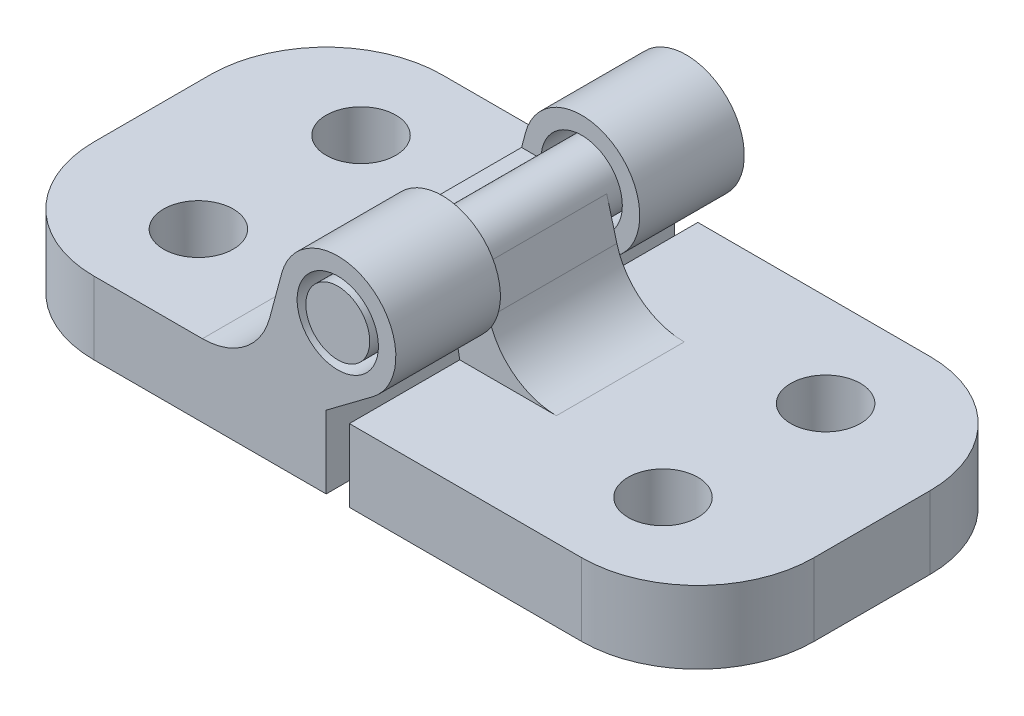
ISO-10303-21;
HEADER;
FILE_DESCRIPTION(('STEP AP214'),'2;1');
FILE_NAME('part.step','',(''),(''),'','','');
FILE_SCHEMA(('AUTOMOTIVE_DESIGN { 1 0 10303 214 1 1 1 1 }'));
ENDSEC;
DATA;
#1=APPLICATION_CONTEXT('core data for automotive mechanical design processes');
#2=APPLICATION_PROTOCOL_DEFINITION('international standard','automotive_design',2000,#1);
#3=PRODUCT_CONTEXT('',#1,'mechanical');
#4=PRODUCT('Part','Part','',(#3));
#5=PRODUCT_RELATED_PRODUCT_CATEGORY('part','',(#4));
#6=PRODUCT_DEFINITION_FORMATION('','',#4);
#7=PRODUCT_DEFINITION_CONTEXT('part definition',#1,'design');
#8=PRODUCT_DEFINITION('design','',#6,#7);
#9=PRODUCT_DEFINITION_SHAPE('','',#8);
#10=(LENGTH_UNIT() NAMED_UNIT(*) SI_UNIT(.MILLI.,.METRE.));
#11=(NAMED_UNIT(*) PLANE_ANGLE_UNIT() SI_UNIT($,.RADIAN.));
#12=(NAMED_UNIT(*) SI_UNIT($,.STERADIAN.) SOLID_ANGLE_UNIT());
#13=UNCERTAINTY_MEASURE_WITH_UNIT(LENGTH_MEASURE(1.E-05),#10,'distance_accuracy_value','');
#14=(GEOMETRIC_REPRESENTATION_CONTEXT(3) GLOBAL_UNCERTAINTY_ASSIGNED_CONTEXT((#13)) GLOBAL_UNIT_ASSIGNED_CONTEXT((#10,
#11,#12)) REPRESENTATION_CONTEXT('',''));
#15=CARTESIAN_POINT('',(0.,0.,0.));
#16=DIRECTION('',(0.,0.,1.));
#17=DIRECTION('',(1.,0.,0.));
#18=AXIS2_PLACEMENT_3D('',#15,#16,#17);
#19=CARTESIAN_POINT('',(15.501,3.375,2.75));
#20=DIRECTION('',(0.,0.,-1.));
#21=DIRECTION('',(-1.,0.,0.));
#22=AXIS2_PLACEMENT_3D('',#19,#20,#21);
#23=PLANE('',#22);
#24=CARTESIAN_POINT('',(0.,6.625,2.75));
#25=DIRECTION('',(0.,0.,-1.));
#26=DIRECTION('',(-1.,0.,0.));
#27=AXIS2_PLACEMENT_3D('',#24,#25,#26);
#28=CIRCLE('',#27,1.375);
#29=CARTESIAN_POINT('',(0.124312268872174,5.25563099939868,2.75));
#30=VERTEX_POINT('',#29);
#31=CARTESIAN_POINT('',(1.32814801114747,6.98087618701597,2.75));
#32=VERTEX_POINT('',#31);
#33=EDGE_CURVE('E208',#30,#32,#28,.F.);
#34=ORIENTED_EDGE('',*,*,#33,.F.);
#35=DIRECTION('',(-0.173648177666927,0.984807753012209,0.));
#36=VECTOR('',#35,1.);
#37=CARTESIAN_POINT('',(0.124312268872174,5.25563099939868,2.75));
#38=LINE('',#37,#36);
#39=CARTESIAN_POINT('',(0.499999999999995,3.125,2.75));
#40=VERTEX_POINT('',#39);
#41=EDGE_CURVE('E147',#40,#30,#38,.T.);
#42=ORIENTED_EDGE('',*,*,#41,.F.);
#43=DIRECTION('',(-1.,0.,0.));
#44=VECTOR('',#43,1.);
#45=CARTESIAN_POINT('',(0.499999999999996,3.125,2.75));
#46=LINE('',#45,#44);
#47=CARTESIAN_POINT('',(4.66330788550968,3.125,2.75));
#48=VERTEX_POINT('',#47);
#49=EDGE_CURVE('E71',#48,#40,#46,.T.);
#50=ORIENTED_EDGE('',*,*,#49,.F.);
#51=CARTESIAN_POINT('',(4.66330788550968,6.125,2.75));
#52=DIRECTION('',(0.,0.,-1.));
#53=DIRECTION('',(-1.,0.,0.));
#54=AXIS2_PLACEMENT_3D('',#51,#52,#53);
#55=CIRCLE('',#54,3.);
#56=CARTESIAN_POINT('',(1.76553040664248,5.34854286469243,2.75));
#57=VERTEX_POINT('',#56);
#58=EDGE_CURVE('E13',#48,#57,#55,.T.);
#59=ORIENTED_EDGE('',*,*,#58,.T.);
#60=DIRECTION('',(0.258819045102525,-0.965925826289067,0.));
#61=VECTOR('',#60,1.);
#62=CARTESIAN_POINT('',(2.36132692157281,3.125,2.75));
#63=LINE('',#62,#61);
#64=EDGE_CURVE('E149',#32,#57,#63,.T.);
#65=ORIENTED_EDGE('',*,*,#64,.F.);
#66=EDGE_LOOP('',(#34,#42,#50,#59,#65));
#67=FACE_BOUND('',#66,.T.);
#68=ADVANCED_FACE('F49',(#67),#23,.F.);
#69=CARTESIAN_POINT('',(0.,3.125,0.));
#70=DIRECTION('',(0.,1.,0.));
#71=DIRECTION('',(0.,0.,1.));
#72=AXIS2_PLACEMENT_3D('',#69,#70,#71);
#73=PLANE('',#72);
#74=CARTESIAN_POINT('',(10.,3.125,3.5));
#75=DIRECTION('',(0.,1.,0.));
#76=DIRECTION('',(0.,0.,1.));
#77=AXIS2_PLACEMENT_3D('',#74,#75,#76);
#78=CIRCLE('',#77,1.5);
#79=CARTESIAN_POINT('',(10.,3.125,5.));
#80=VERTEX_POINT('',#79);
#81=EDGE_CURVE('E304',#80,#80,#78,.T.);
#82=ORIENTED_EDGE('',*,*,#81,.F.);
#83=EDGE_LOOP('',(#82));
#84=FACE_BOUND('',#83,.T.);
#85=CARTESIAN_POINT('',(10.,3.125,-3.5));
#86=DIRECTION('',(0.,1.,0.));
#87=DIRECTION('',(0.,0.,-1.));
#88=AXIS2_PLACEMENT_3D('',#85,#86,#87);
#89=CIRCLE('',#88,1.5);
#90=CARTESIAN_POINT('',(10.,3.125,-5.));
#91=VERTEX_POINT('',#90);
#92=EDGE_CURVE('E317',#91,#91,#89,.T.);
#93=ORIENTED_EDGE('',*,*,#92,.F.);
#94=EDGE_LOOP('',(#93));
#95=FACE_BOUND('',#94,.T.);
#96=DIRECTION('',(-1.,0.,0.));
#97=VECTOR('',#96,1.);
#98=CARTESIAN_POINT('',(0.499999999999996,3.125,-2.75));
#99=LINE('',#98,#97);
#100=CARTESIAN_POINT('',(4.66330788550968,3.125,-2.75));
#101=VERTEX_POINT('',#100);
#102=CARTESIAN_POINT('',(0.499999999999996,3.125,-2.75));
#103=VERTEX_POINT('',#102);
#104=EDGE_CURVE('E64',#101,#103,#99,.T.);
#105=ORIENTED_EDGE('',*,*,#104,.F.);
#106=DIRECTION('',(0.,0.,-1.));
#107=VECTOR('',#106,1.);
#108=CARTESIAN_POINT('',(4.66330788550968,3.125,0.));
#109=LINE('',#108,#107);
#110=EDGE_CURVE('E186',#101,#48,#109,.F.);
#111=ORIENTED_EDGE('',*,*,#110,.T.);
#112=ORIENTED_EDGE('',*,*,#49,.T.);
#113=DIRECTION('',(0.,0.,-1.));
#114=VECTOR('',#113,1.);
#115=CARTESIAN_POINT('',(0.499999999999996,3.125,7.5));
#116=LINE('',#115,#114);
#117=CARTESIAN_POINT('',(0.499999999999996,3.125,7.5));
#118=VERTEX_POINT('',#117);
#119=EDGE_CURVE('E195',#118,#40,#116,.T.);
#120=ORIENTED_EDGE('',*,*,#119,.F.);
#121=DIRECTION('',(-1.,0.,0.));
#122=VECTOR('',#121,1.);
#123=CARTESIAN_POINT('',(15.5,3.125,7.5));
#124=LINE('',#123,#122);
#125=CARTESIAN_POINT('',(10.5,3.125,7.5));
#126=VERTEX_POINT('',#125);
#127=EDGE_CURVE('E219',#126,#118,#124,.T.);
#128=ORIENTED_EDGE('',*,*,#127,.F.);
#129=CARTESIAN_POINT('',(10.5,3.125,2.5));
#130=DIRECTION('',(0.,1.,0.));
#131=DIRECTION('',(0.,0.,1.));
#132=AXIS2_PLACEMENT_3D('',#129,#130,#131);
#133=CIRCLE('',#132,5.);
#134=CARTESIAN_POINT('',(15.5,3.125,2.5));
#135=VERTEX_POINT('',#134);
#136=EDGE_CURVE('E178',#126,#135,#133,.T.);
#137=ORIENTED_EDGE('',*,*,#136,.T.);
#138=DIRECTION('',(0.,0.,-1.));
#139=VECTOR('',#138,1.);
#140=CARTESIAN_POINT('',(15.5,3.125,7.5));
#141=LINE('',#140,#139);
#142=CARTESIAN_POINT('',(15.5,3.125,-2.5));
#143=VERTEX_POINT('',#142);
#144=EDGE_CURVE('E165',#135,#143,#141,.T.);
#145=ORIENTED_EDGE('',*,*,#144,.T.);
#146=CARTESIAN_POINT('',(10.5,3.125,-2.5));
#147=DIRECTION('',(0.,1.,0.));
#148=DIRECTION('',(0.,0.,1.));
#149=AXIS2_PLACEMENT_3D('',#146,#147,#148);
#150=CIRCLE('',#149,5.);
#151=CARTESIAN_POINT('',(10.5,3.125,-7.5));
#152=VERTEX_POINT('',#151);
#153=EDGE_CURVE('E176',#143,#152,#150,.T.);
#154=ORIENTED_EDGE('',*,*,#153,.T.);
#155=DIRECTION('',(-1.,0.,0.));
#156=VECTOR('',#155,1.);
#157=CARTESIAN_POINT('',(15.5,3.125,-7.5));
#158=LINE('',#157,#156);
#159=CARTESIAN_POINT('',(0.499999999999994,3.125,-7.5));
#160=VERTEX_POINT('',#159);
#161=EDGE_CURVE('E204',#152,#160,#158,.T.);
#162=ORIENTED_EDGE('',*,*,#161,.T.);
#163=EDGE_CURVE('E205',#103,#160,#116,.T.);
#164=ORIENTED_EDGE('',*,*,#163,.F.);
#165=EDGE_LOOP('',(#105,#111,#112,#120,#128,#137,#145,#154,#162,#164));
#166=FACE_BOUND('',#165,.T.);
#167=ADVANCED_FACE('F191',(#84,#95,#166),#73,.T.);
#168=CARTESIAN_POINT('',(15.5,3.125,7.5));
#169=DIRECTION('',(-1.,0.,0.));
#170=DIRECTION('',(0.,0.,1.));
#171=AXIS2_PLACEMENT_3D('',#168,#169,#170);
#172=PLANE('',#171);
#173=ORIENTED_EDGE('',*,*,#144,.F.);
#174=DIRECTION('',(0.,-1.,0.));
#175=VECTOR('',#174,1.);
#176=CARTESIAN_POINT('',(15.5,0.,2.5));
#177=LINE('',#176,#175);
#178=CARTESIAN_POINT('',(15.5,0.,2.5));
#179=VERTEX_POINT('',#178);
#180=EDGE_CURVE('E159',#135,#179,#177,.T.);
#181=ORIENTED_EDGE('',*,*,#180,.T.);
#182=DIRECTION('',(0.,0.,-1.));
#183=VECTOR('',#182,1.);
#184=CARTESIAN_POINT('',(15.5,0.,7.5));
#185=LINE('',#184,#183);
#186=CARTESIAN_POINT('',(15.5,0.,-2.5));
#187=VERTEX_POINT('',#186);
#188=EDGE_CURVE('E157',#179,#187,#185,.T.);
#189=ORIENTED_EDGE('',*,*,#188,.T.);
#190=DIRECTION('',(0.,-1.,0.));
#191=VECTOR('',#190,1.);
#192=CARTESIAN_POINT('',(15.5,3.125,-2.5));
#193=LINE('',#192,#191);
#194=EDGE_CURVE('E156',#187,#143,#193,.F.);
#195=ORIENTED_EDGE('',*,*,#194,.T.);
#196=EDGE_LOOP('',(#173,#181,#189,#195));
#197=FACE_BOUND('',#196,.T.);
#198=ADVANCED_FACE('F250',(#197),#172,.F.);
#199=CARTESIAN_POINT('',(15.5,3.125,-7.5));
#200=DIRECTION('',(0.,0.,1.));
#201=DIRECTION('',(1.,0.,0.));
#202=AXIS2_PLACEMENT_3D('',#199,#200,#201);
#203=PLANE('',#202);
#204=ORIENTED_EDGE('',*,*,#161,.F.);
#205=DIRECTION('',(0.,-1.,0.));
#206=VECTOR('',#205,1.);
#207=CARTESIAN_POINT('',(10.5,3.125,-7.5));
#208=LINE('',#207,#206);
#209=CARTESIAN_POINT('',(10.5,0.,-7.5));
#210=VERTEX_POINT('',#209);
#211=EDGE_CURVE('E180',#152,#210,#208,.T.);
#212=ORIENTED_EDGE('',*,*,#211,.T.);
#213=DIRECTION('',(-1.,0.,0.));
#214=VECTOR('',#213,1.);
#215=CARTESIAN_POINT('',(15.5,0.,-7.5));
#216=LINE('',#215,#214);
#217=CARTESIAN_POINT('',(0.499999999999994,0.,-7.5));
#218=VERTEX_POINT('',#217);
#219=EDGE_CURVE('E162',#210,#218,#216,.T.);
#220=ORIENTED_EDGE('',*,*,#219,.T.);
#221=DIRECTION('',(0.,-1.,0.));
#222=VECTOR('',#221,1.);
#223=CARTESIAN_POINT('',(0.499999999999994,3.125,-7.5));
#224=LINE('',#223,#222);
#225=EDGE_CURVE('E209',#160,#218,#224,.T.);
#226=ORIENTED_EDGE('',*,*,#225,.F.);
#227=EDGE_LOOP('',(#204,#212,#220,#226));
#228=FACE_BOUND('',#227,.T.);
#229=ADVANCED_FACE('F239',(#228),#203,.F.);
#230=CARTESIAN_POINT('',(0.499999999999996,3.125,7.5));
#231=DIRECTION('',(-1.,0.,0.));
#232=DIRECTION('',(0.,0.,1.));
#233=AXIS2_PLACEMENT_3D('',#230,#231,#232);
#234=PLANE('',#233);
#235=DIRECTION('',(0.,0.,-1.));
#236=VECTOR('',#235,1.);
#237=CARTESIAN_POINT('',(0.499999999999996,0.,7.5));
#238=LINE('',#237,#236);
#239=CARTESIAN_POINT('',(0.499999999999996,0.,7.5));
#240=VERTEX_POINT('',#239);
#241=EDGE_CURVE('E222',#240,#218,#238,.T.);
#242=ORIENTED_EDGE('',*,*,#241,.F.);
#243=DIRECTION('',(0.,-1.,0.));
#244=VECTOR('',#243,1.);
#245=CARTESIAN_POINT('',(0.499999999999996,3.125,7.5));
#246=LINE('',#245,#244);
#247=EDGE_CURVE('E203',#118,#240,#246,.T.);
#248=ORIENTED_EDGE('',*,*,#247,.F.);
#249=ORIENTED_EDGE('',*,*,#119,.T.);
#250=DIRECTION('',(0.,0.,-1.));
#251=VECTOR('',#250,1.);
#252=CARTESIAN_POINT('',(0.499999999999996,3.125,9.14213023835133));
#253=LINE('',#252,#251);
#254=EDGE_CURVE('E150',#40,#103,#253,.T.);
#255=ORIENTED_EDGE('',*,*,#254,.T.);
#256=ORIENTED_EDGE('',*,*,#163,.T.);
#257=ORIENTED_EDGE('',*,*,#225,.T.);
#258=EDGE_LOOP('',(#242,#248,#249,#255,#256,#257));
#259=FACE_BOUND('',#258,.T.);
#260=ADVANCED_FACE('F200',(#259),#234,.T.);
#261=CARTESIAN_POINT('',(15.5,3.125,7.5));
#262=DIRECTION('',(0.,0.,1.));
#263=DIRECTION('',(1.,0.,0.));
#264=AXIS2_PLACEMENT_3D('',#261,#262,#263);
#265=PLANE('',#264);
#266=DIRECTION('',(-1.,0.,0.));
#267=VECTOR('',#266,1.);
#268=CARTESIAN_POINT('',(15.5,0.,7.5));
#269=LINE('',#268,#267);
#270=CARTESIAN_POINT('',(10.5,0.,7.5));
#271=VERTEX_POINT('',#270);
#272=EDGE_CURVE('E220',#271,#240,#269,.T.);
#273=ORIENTED_EDGE('',*,*,#272,.F.);
#274=DIRECTION('',(0.,-1.,0.));
#275=VECTOR('',#274,1.);
#276=CARTESIAN_POINT('',(10.5,3.125,7.5));
#277=LINE('',#276,#275);
#278=EDGE_CURVE('E174',#271,#126,#277,.F.);
#279=ORIENTED_EDGE('',*,*,#278,.T.);
#280=ORIENTED_EDGE('',*,*,#127,.T.);
#281=ORIENTED_EDGE('',*,*,#247,.T.);
#282=EDGE_LOOP('',(#273,#279,#280,#281));
#283=FACE_BOUND('',#282,.T.);
#284=ADVANCED_FACE('F247',(#283),#265,.T.);
#285=CARTESIAN_POINT('',(0.,0.,0.));
#286=DIRECTION('',(0.,1.,0.));
#287=DIRECTION('',(0.,0.,1.));
#288=AXIS2_PLACEMENT_3D('',#285,#286,#287);
#289=PLANE('',#288);
#290=CARTESIAN_POINT('',(10.,0.,3.5));
#291=DIRECTION('',(0.,1.,0.));
#292=DIRECTION('',(0.,0.,1.));
#293=AXIS2_PLACEMENT_3D('',#290,#291,#292);
#294=CIRCLE('',#293,1.5);
#295=CARTESIAN_POINT('',(10.,0.,5.));
#296=VERTEX_POINT('',#295);
#297=EDGE_CURVE('E307',#296,#296,#294,.F.);
#298=ORIENTED_EDGE('',*,*,#297,.F.);
#299=EDGE_LOOP('',(#298));
#300=FACE_BOUND('',#299,.T.);
#301=CARTESIAN_POINT('',(10.,0.,-3.5));
#302=DIRECTION('',(0.,1.,0.));
#303=DIRECTION('',(0.,0.,1.));
#304=AXIS2_PLACEMENT_3D('',#301,#302,#303);
#305=CIRCLE('',#304,1.5);
#306=CARTESIAN_POINT('',(10.,0.,-2.));
#307=VERTEX_POINT('',#306);
#308=EDGE_CURVE('E314',#307,#307,#305,.F.);
#309=ORIENTED_EDGE('',*,*,#308,.F.);
#310=EDGE_LOOP('',(#309));
#311=FACE_BOUND('',#310,.T.);
#312=ORIENTED_EDGE('',*,*,#188,.F.);
#313=CARTESIAN_POINT('',(10.5,0.,2.5));
#314=DIRECTION('',(0.,1.,0.));
#315=DIRECTION('',(0.,0.,1.));
#316=AXIS2_PLACEMENT_3D('',#313,#314,#315);
#317=CIRCLE('',#316,5.);
#318=EDGE_CURVE('E172',#179,#271,#317,.F.);
#319=ORIENTED_EDGE('',*,*,#318,.T.);
#320=ORIENTED_EDGE('',*,*,#272,.T.);
#321=ORIENTED_EDGE('',*,*,#241,.T.);
#322=ORIENTED_EDGE('',*,*,#219,.F.);
#323=CARTESIAN_POINT('',(10.5,0.,-2.5));
#324=DIRECTION('',(0.,1.,0.));
#325=DIRECTION('',(0.,0.,1.));
#326=AXIS2_PLACEMENT_3D('',#323,#324,#325);
#327=CIRCLE('',#326,5.);
#328=EDGE_CURVE('E170',#210,#187,#327,.F.);
#329=ORIENTED_EDGE('',*,*,#328,.T.);
#330=EDGE_LOOP('',(#312,#319,#320,#321,#322,#329));
#331=FACE_BOUND('',#330,.T.);
#332=ADVANCED_FACE('F243',(#300,#311,#331),#289,.F.);
#333=CARTESIAN_POINT('',(2.36132692157281,3.125,9.14213023835133));
#334=DIRECTION('',(-0.965925826289067,-0.258819045102525,0.));
#335=DIRECTION('',(0.258819045102525,-0.965925826289067,0.));
#336=AXIS2_PLACEMENT_3D('',#333,#334,#335);
#337=PLANE('',#336);
#338=ORIENTED_EDGE('',*,*,#64,.T.);
#339=DIRECTION('',(0.,0.,-1.));
#340=VECTOR('',#339,1.);
#341=CARTESIAN_POINT('',(1.76553040664248,5.34854286469243,9.14213023835133));
#342=LINE('',#341,#340);
#343=CARTESIAN_POINT('',(1.76553040664248,5.34854286469243,-2.75));
#344=VERTEX_POINT('',#343);
#345=EDGE_CURVE('E183',#57,#344,#342,.T.);
#346=ORIENTED_EDGE('',*,*,#345,.T.);
#347=DIRECTION('',(0.258819045102525,-0.965925826289067,0.));
#348=VECTOR('',#347,1.);
#349=CARTESIAN_POINT('',(2.36132692157281,3.125,-2.75));
#350=LINE('',#349,#348);
#351=CARTESIAN_POINT('',(1.32814801114747,6.98087618701597,-2.75));
#352=VERTEX_POINT('',#351);
#353=EDGE_CURVE('E141',#352,#344,#350,.T.);
#354=ORIENTED_EDGE('',*,*,#353,.F.);
#355=DIRECTION('',(0.,0.,-1.));
#356=VECTOR('',#355,1.);
#357=CARTESIAN_POINT('',(1.32814801114747,6.98087618701597,9.14213023835133));
#358=LINE('',#357,#356);
#359=EDGE_CURVE('E140',#32,#352,#358,.T.);
#360=ORIENTED_EDGE('',*,*,#359,.F.);
#361=EDGE_LOOP('',(#338,#346,#354,#360));
#362=FACE_BOUND('',#361,.T.);
#363=ADVANCED_FACE('F268',(#362),#337,.F.);
#364=CARTESIAN_POINT('',(0.124312268872174,5.25563099939868,9.14213023835133));
#365=DIRECTION('',(0.984807753012209,0.173648177666927,0.));
#366=DIRECTION('',(-0.173648177666927,0.984807753012209,0.));
#367=AXIS2_PLACEMENT_3D('',#364,#365,#366);
#368=PLANE('',#367);
#369=ORIENTED_EDGE('',*,*,#254,.F.);
#370=ORIENTED_EDGE('',*,*,#41,.T.);
#371=DIRECTION('',(0.,0.,-1.));
#372=VECTOR('',#371,1.);
#373=CARTESIAN_POINT('',(0.124312268872174,5.25563099939868,9.14213023835133));
#374=LINE('',#373,#372);
#375=CARTESIAN_POINT('',(0.124312268872174,5.25563099939868,-2.75));
#376=VERTEX_POINT('',#375);
#377=EDGE_CURVE('E145',#30,#376,#374,.T.);
#378=ORIENTED_EDGE('',*,*,#377,.T.);
#379=DIRECTION('',(-0.173648177666927,0.984807753012209,0.));
#380=VECTOR('',#379,1.);
#381=CARTESIAN_POINT('',(0.124312268872174,5.25563099939868,-2.75));
#382=LINE('',#381,#380);
#383=EDGE_CURVE('E131',#103,#376,#382,.T.);
#384=ORIENTED_EDGE('',*,*,#383,.F.);
#385=EDGE_LOOP('',(#369,#370,#378,#384));
#386=FACE_BOUND('',#385,.T.);
#387=ADVANCED_FACE('F146',(#386),#368,.F.);
#388=CARTESIAN_POINT('',(0.,6.625,9.14213023835133));
#389=DIRECTION('',(0.,0.,-1.));
#390=DIRECTION('',(-1.,0.,0.));
#391=AXIS2_PLACEMENT_3D('',#388,#389,#390);
#392=CYLINDRICAL_SURFACE('',#391,1.375);
#393=ORIENTED_EDGE('',*,*,#377,.F.);
#394=ORIENTED_EDGE('',*,*,#33,.T.);
#395=ORIENTED_EDGE('',*,*,#359,.T.);
#396=CARTESIAN_POINT('',(0.,6.625,-2.75));
#397=DIRECTION('',(0.,0.,1.));
#398=DIRECTION('',(1.,0.,0.));
#399=AXIS2_PLACEMENT_3D('',#396,#397,#398);
#400=CIRCLE('',#399,1.375);
#401=EDGE_CURVE('E136',#352,#376,#400,.F.);
#402=ORIENTED_EDGE('',*,*,#401,.T.);
#403=EDGE_LOOP('',(#393,#394,#395,#402));
#404=FACE_BOUND('',#403,.T.);
#405=CARTESIAN_POINT('',(0.,6.625,-7.5));
#406=DIRECTION('',(0.,0.,-1.));
#407=DIRECTION('',(-1.,0.,0.));
#408=AXIS2_PLACEMENT_3D('',#405,#406,#407);
#409=CIRCLE('',#408,1.375);
#410=CARTESIAN_POINT('',(-1.375,6.625,-7.5));
#411=VERTEX_POINT('',#410);
#412=EDGE_CURVE('E309',#411,#411,#409,.F.);
#413=ORIENTED_EDGE('',*,*,#412,.T.);
#414=EDGE_LOOP('',(#413));
#415=FACE_BOUND('',#414,.T.);
#416=CARTESIAN_POINT('',(0.,6.625,7.5));
#417=DIRECTION('',(0.,0.,-1.));
#418=DIRECTION('',(-1.,0.,0.));
#419=AXIS2_PLACEMENT_3D('',#416,#417,#418);
#420=CIRCLE('',#419,1.375);
#421=CARTESIAN_POINT('',(-1.375,6.625,7.5));
#422=VERTEX_POINT('',#421);
#423=EDGE_CURVE('E312',#422,#422,#420,.T.);
#424=ORIENTED_EDGE('',*,*,#423,.T.);
#425=EDGE_LOOP('',(#424));
#426=FACE_BOUND('',#425,.T.);
#427=ADVANCED_FACE('F152',(#404,#415,#426),#392,.T.);
#428=CARTESIAN_POINT('',(15.501,3.375,-2.75));
#429=DIRECTION('',(0.,0.,1.));
#430=DIRECTION('',(1.,0.,0.));
#431=AXIS2_PLACEMENT_3D('',#428,#429,#430);
#432=PLANE('',#431);
#433=ORIENTED_EDGE('',*,*,#401,.F.);
#434=ORIENTED_EDGE('',*,*,#353,.T.);
#435=CARTESIAN_POINT('',(4.66330788550968,6.125,-2.75));
#436=DIRECTION('',(0.,0.,1.));
#437=DIRECTION('',(1.,0.,0.));
#438=AXIS2_PLACEMENT_3D('',#435,#436,#437);
#439=CIRCLE('',#438,3.);
#440=EDGE_CURVE('E57',#344,#101,#439,.T.);
#441=ORIENTED_EDGE('',*,*,#440,.T.);
#442=ORIENTED_EDGE('',*,*,#104,.T.);
#443=ORIENTED_EDGE('',*,*,#383,.T.);
#444=EDGE_LOOP('',(#433,#434,#441,#442,#443));
#445=FACE_BOUND('',#444,.T.);
#446=ADVANCED_FACE('F133',(#445),#432,.F.);
#447=CARTESIAN_POINT('',(-15.5,3.125,-7.5));
#448=DIRECTION('',(0.,0.,-1.));
#449=DIRECTION('',(-1.,0.,0.));
#450=AXIS2_PLACEMENT_3D('',#447,#448,#449);
#451=PLANE('',#450);
#452=ORIENTED_EDGE('',*,*,#412,.F.);
#453=EDGE_LOOP('',(#452));
#454=FACE_BOUND('',#453,.T.);
#455=ADVANCED_FACE('F277',(#454),#451,.T.);
#456=CARTESIAN_POINT('',(-15.5,3.125,7.5));
#457=DIRECTION('',(0.,0.,-1.));
#458=DIRECTION('',(-1.,0.,0.));
#459=AXIS2_PLACEMENT_3D('',#456,#457,#458);
#460=PLANE('',#459);
#461=ORIENTED_EDGE('',*,*,#423,.F.);
#462=EDGE_LOOP('',(#461));
#463=FACE_BOUND('',#462,.T.);
#464=ADVANCED_FACE('F281',(#463),#460,.F.);
#465=CARTESIAN_POINT('',(10.,-0.00100000000000013,-3.5));
#466=DIRECTION('',(0.,1.,0.));
#467=DIRECTION('',(0.,0.,1.));
#468=AXIS2_PLACEMENT_3D('',#465,#466,#467);
#469=CYLINDRICAL_SURFACE('',#468,1.5);
#470=ORIENTED_EDGE('',*,*,#92,.T.);
#471=EDGE_LOOP('',(#470));
#472=FACE_BOUND('',#471,.T.);
#473=ORIENTED_EDGE('',*,*,#308,.T.);
#474=EDGE_LOOP('',(#473));
#475=FACE_BOUND('',#474,.T.);
#476=ADVANCED_FACE('F287',(#472,#475),#469,.F.);
#477=CARTESIAN_POINT('',(10.,-0.00100000000000013,3.5));
#478=DIRECTION('',(0.,1.,0.));
#479=DIRECTION('',(0.,0.,1.));
#480=AXIS2_PLACEMENT_3D('',#477,#478,#479);
#481=CYLINDRICAL_SURFACE('',#480,1.5);
#482=ORIENTED_EDGE('',*,*,#81,.T.);
#483=EDGE_LOOP('',(#482));
#484=FACE_BOUND('',#483,.T.);
#485=ORIENTED_EDGE('',*,*,#297,.T.);
#486=EDGE_LOOP('',(#485));
#487=FACE_BOUND('',#486,.T.);
#488=ADVANCED_FACE('F293',(#484,#487),#481,.F.);
#489=CARTESIAN_POINT('',(10.5,3.125,2.5));
#490=DIRECTION('',(0.,1.,0.));
#491=DIRECTION('',(0.,0.,1.));
#492=AXIS2_PLACEMENT_3D('',#489,#490,#491);
#493=CYLINDRICAL_SURFACE('',#492,5.);
#494=ORIENTED_EDGE('',*,*,#136,.F.);
#495=ORIENTED_EDGE('',*,*,#278,.F.);
#496=ORIENTED_EDGE('',*,*,#318,.F.);
#497=ORIENTED_EDGE('',*,*,#180,.F.);
#498=EDGE_LOOP('',(#494,#495,#496,#497));
#499=FACE_BOUND('',#498,.T.);
#500=ADVANCED_FACE('F249',(#499),#493,.T.);
#501=CARTESIAN_POINT('',(10.5,3.125,-2.5));
#502=DIRECTION('',(0.,-1.,0.));
#503=DIRECTION('',(0.,0.,-1.));
#504=AXIS2_PLACEMENT_3D('',#501,#502,#503);
#505=CYLINDRICAL_SURFACE('',#504,5.);
#506=ORIENTED_EDGE('',*,*,#153,.F.);
#507=ORIENTED_EDGE('',*,*,#194,.F.);
#508=ORIENTED_EDGE('',*,*,#328,.F.);
#509=ORIENTED_EDGE('',*,*,#211,.F.);
#510=EDGE_LOOP('',(#506,#507,#508,#509));
#511=FACE_BOUND('',#510,.T.);
#512=ADVANCED_FACE('F236',(#511),#505,.T.);
#513=CARTESIAN_POINT('',(4.66330788550968,6.125,9.14213023835133));
#514=DIRECTION('',(0.,0.,-1.));
#515=DIRECTION('',(-1.,0.,0.));
#516=AXIS2_PLACEMENT_3D('',#513,#514,#515);
#517=CYLINDRICAL_SURFACE('',#516,3.);
#518=ORIENTED_EDGE('',*,*,#58,.F.);
#519=ORIENTED_EDGE('',*,*,#110,.F.);
#520=ORIENTED_EDGE('',*,*,#440,.F.);
#521=ORIENTED_EDGE('',*,*,#345,.F.);
#522=EDGE_LOOP('',(#518,#519,#520,#521));
#523=FACE_BOUND('',#522,.T.);
#524=ADVANCED_FACE('F51',(#523),#517,.F.);
#525=CLOSED_SHELL('',(#68,#167,#198,#229,#260,#284,#332,#363,#387,#427,#446,#455,#464,#476,#488,
#500,#512,#524));
#526=MANIFOLD_SOLID_BREP('B2',#525);
#527=CARTESIAN_POINT('',(0.,6.625,-16.0036949704846));
#528=DIRECTION('',(0.,0.,1.));
#529=DIRECTION('',(1.,0.,0.));
#530=AXIS2_PLACEMENT_3D('',#527,#528,#529);
#531=CYLINDRICAL_SURFACE('',#530,2.5);
#532=CARTESIAN_POINT('',(0.,6.625,3.));
#533=DIRECTION('',(0.,0.,-1.));
#534=DIRECTION('',(-1.,0.,0.));
#535=AXIS2_PLACEMENT_3D('',#532,#533,#534);
#536=CIRCLE('',#535,2.5);
#537=CARTESIAN_POINT('',(-2.41481456572267,7.27204761275631,3.));
#538=VERTEX_POINT('',#537);
#539=CARTESIAN_POINT('',(1.5,4.625,3.));
#540=VERTEX_POINT('',#539);
#541=EDGE_CURVE('E569',#538,#540,#536,.T.);
#542=ORIENTED_EDGE('',*,*,#541,.F.);
#543=DIRECTION('',(0.,0.,1.));
#544=VECTOR('',#543,1.);
#545=CARTESIAN_POINT('',(-2.41481456572267,7.27204761275631,-16.0036949704846));
#546=LINE('',#545,#544);
#547=CARTESIAN_POINT('',(-2.41481456572267,7.27204761275631,7.5));
#548=VERTEX_POINT('',#547);
#549=EDGE_CURVE('E586',#538,#548,#546,.T.);
#550=ORIENTED_EDGE('',*,*,#549,.T.);
#551=CARTESIAN_POINT('',(0.,6.625,7.5));
#552=DIRECTION('',(0.,0.,1.));
#553=DIRECTION('',(1.,0.,0.));
#554=AXIS2_PLACEMENT_3D('',#551,#552,#553);
#555=CIRCLE('',#554,2.5);
#556=CARTESIAN_POINT('',(1.5,4.625,7.5));
#557=VERTEX_POINT('',#556);
#558=EDGE_CURVE('E657',#557,#548,#555,.T.);
#559=ORIENTED_EDGE('',*,*,#558,.F.);
#560=DIRECTION('',(0.,0.,1.));
#561=VECTOR('',#560,1.);
#562=CARTESIAN_POINT('',(1.5,4.625,-16.0036949704846));
#563=LINE('',#562,#561);
#564=EDGE_CURVE('E589',#540,#557,#563,.T.);
#565=ORIENTED_EDGE('',*,*,#564,.F.);
#566=EDGE_LOOP('',(#542,#550,#559,#565));
#567=FACE_BOUND('',#566,.T.);
#568=ADVANCED_FACE('F443',(#567),#531,.T.);
#569=CARTESIAN_POINT('',(-2.41481456572267,7.27204761275631,-7.5));
#570=VERTEX_POINT('',#569);
#571=CARTESIAN_POINT('',(-2.41481456572267,7.27204761275631,-3.));
#572=VERTEX_POINT('',#571);
#573=EDGE_CURVE('E576',#570,#572,#546,.T.);
#574=ORIENTED_EDGE('',*,*,#573,.T.);
#575=CARTESIAN_POINT('',(0.,6.625,-3.));
#576=DIRECTION('',(0.,0.,1.));
#577=DIRECTION('',(1.,0.,0.));
#578=AXIS2_PLACEMENT_3D('',#575,#576,#577);
#579=CIRCLE('',#578,2.5);
#580=CARTESIAN_POINT('',(1.5,4.625,-3.));
#581=VERTEX_POINT('',#580);
#582=EDGE_CURVE('E555',#581,#572,#579,.T.);
#583=ORIENTED_EDGE('',*,*,#582,.F.);
#584=CARTESIAN_POINT('',(1.5,4.625,-7.5));
#585=VERTEX_POINT('',#584);
#586=EDGE_CURVE('E594',#585,#581,#563,.T.);
#587=ORIENTED_EDGE('',*,*,#586,.F.);
#588=CARTESIAN_POINT('',(0.,6.625,-7.5));
#589=DIRECTION('',(0.,0.,-1.));
#590=DIRECTION('',(-1.,0.,0.));
#591=AXIS2_PLACEMENT_3D('',#588,#589,#590);
#592=CIRCLE('',#591,2.5);
#593=EDGE_CURVE('E584',#585,#570,#592,.F.);
#594=ORIENTED_EDGE('',*,*,#593,.T.);
#595=EDGE_LOOP('',(#574,#583,#587,#594));
#596=FACE_BOUND('',#595,.T.);
#597=ADVANCED_FACE('F583',(#596),#531,.T.);
#598=CARTESIAN_POINT('',(-0.500000000000008,3.125,-16.0036949704846));
#599=DIRECTION('',(0.599999999999999,-0.800000000000001,0.));
#600=DIRECTION('',(0.800000000000001,0.599999999999999,0.));
#601=AXIS2_PLACEMENT_3D('',#598,#599,#600);
#602=PLANE('',#601);
#603=ORIENTED_EDGE('',*,*,#586,.T.);
#604=DIRECTION('',(0.800000000000001,0.599999999999999,0.));
#605=VECTOR('',#604,1.);
#606=CARTESIAN_POINT('',(9.86064000000001,10.89548,-3.));
#607=LINE('',#606,#605);
#608=CARTESIAN_POINT('',(0.,3.5,-3.));
#609=VERTEX_POINT('',#608);
#610=EDGE_CURVE('E563',#609,#581,#607,.T.);
#611=ORIENTED_EDGE('',*,*,#610,.F.);
#612=DIRECTION('',(0.,0.,1.));
#613=VECTOR('',#612,1.);
#614=CARTESIAN_POINT('',(0.,3.5,0.));
#615=LINE('',#614,#613);
#616=CARTESIAN_POINT('',(0.,3.50000000000001,3.));
#617=VERTEX_POINT('',#616);
#618=EDGE_CURVE('E664',#609,#617,#615,.T.);
#619=ORIENTED_EDGE('',*,*,#618,.T.);
#620=DIRECTION('',(-0.800000000000001,-0.599999999999999,0.));
#621=VECTOR('',#620,1.);
#622=CARTESIAN_POINT('',(9.86064000000001,10.89548,3.));
#623=LINE('',#622,#621);
#624=EDGE_CURVE('E683',#540,#617,#623,.T.);
#625=ORIENTED_EDGE('',*,*,#624,.F.);
#626=ORIENTED_EDGE('',*,*,#564,.T.);
#627=DIRECTION('',(0.800000000000001,0.599999999999999,0.));
#628=VECTOR('',#627,1.);
#629=CARTESIAN_POINT('',(-0.500000000000008,3.125,7.5));
#630=LINE('',#629,#628);
#631=CARTESIAN_POINT('',(-0.499999999999996,3.125,7.5));
#632=VERTEX_POINT('',#631);
#633=EDGE_CURVE('E661',#632,#557,#630,.T.);
#634=ORIENTED_EDGE('',*,*,#633,.F.);
#635=DIRECTION('',(0.,0.,-1.));
#636=VECTOR('',#635,1.);
#637=CARTESIAN_POINT('',(-0.499999999999996,3.125,7.5));
#638=LINE('',#637,#636);
#639=CARTESIAN_POINT('',(-0.499999999999994,3.125,-7.5));
#640=VERTEX_POINT('',#639);
#641=EDGE_CURVE('E599',#632,#640,#638,.T.);
#642=ORIENTED_EDGE('',*,*,#641,.T.);
#643=DIRECTION('',(0.800000000000001,0.599999999999999,0.));
#644=VECTOR('',#643,1.);
#645=CARTESIAN_POINT('',(-0.500000000000009,3.125,-7.5));
#646=LINE('',#645,#644);
#647=EDGE_CURVE('E585',#640,#585,#646,.T.);
#648=ORIENTED_EDGE('',*,*,#647,.T.);
#649=EDGE_LOOP('',(#603,#611,#619,#625,#626,#634,#642,#648));
#650=FACE_BOUND('',#649,.T.);
#651=ADVANCED_FACE('F747',(#650),#602,.T.);
#652=CARTESIAN_POINT('',(-15.5,3.125,7.5));
#653=DIRECTION('',(0.,0.,-1.));
#654=DIRECTION('',(-1.,0.,0.));
#655=AXIS2_PLACEMENT_3D('',#652,#653,#654);
#656=PLANE('',#655);
#657=DIRECTION('',(1.,0.,0.));
#658=VECTOR('',#657,1.);
#659=CARTESIAN_POINT('',(-15.5,3.125,7.5));
#660=LINE('',#659,#658);
#661=CARTESIAN_POINT('',(-10.5,3.125,7.5));
#662=VERTEX_POINT('',#661);
#663=CARTESIAN_POINT('',(-5.82799358847103,3.125,7.5));
#664=VERTEX_POINT('',#663);
#665=EDGE_CURVE('E597',#662,#664,#660,.T.);
#666=ORIENTED_EDGE('',*,*,#665,.F.);
#667=DIRECTION('',(0.,-1.,0.));
#668=VECTOR('',#667,1.);
#669=CARTESIAN_POINT('',(-10.5,0.,7.5));
#670=LINE('',#669,#668);
#671=CARTESIAN_POINT('',(-10.5,0.,7.5));
#672=VERTEX_POINT('',#671);
#673=EDGE_CURVE('E639',#662,#672,#670,.T.);
#674=ORIENTED_EDGE('',*,*,#673,.T.);
#675=DIRECTION('',(1.,0.,0.));
#676=VECTOR('',#675,1.);
#677=CARTESIAN_POINT('',(-15.5,0.,7.5));
#678=LINE('',#677,#676);
#679=CARTESIAN_POINT('',(-0.499999999999996,0.,7.5));
#680=VERTEX_POINT('',#679);
#681=EDGE_CURVE('E609',#672,#680,#678,.T.);
#682=ORIENTED_EDGE('',*,*,#681,.T.);
#683=DIRECTION('',(0.,-1.,0.));
#684=VECTOR('',#683,1.);
#685=CARTESIAN_POINT('',(-0.499999999999996,3.125,7.5));
#686=LINE('',#685,#684);
#687=EDGE_CURVE('E621',#632,#680,#686,.T.);
#688=ORIENTED_EDGE('',*,*,#687,.F.);
#689=ORIENTED_EDGE('',*,*,#633,.T.);
#690=ORIENTED_EDGE('',*,*,#558,.T.);
#691=DIRECTION('',(-0.258819045102525,-0.965925826289067,0.));
#692=VECTOR('',#691,1.);
#693=CARTESIAN_POINT('',(-2.41481456572267,7.27204761275631,7.5));
#694=LINE('',#693,#692);
#695=CARTESIAN_POINT('',(-2.93021610960383,5.34854286469243,7.5));
#696=VERTEX_POINT('',#695);
#697=EDGE_CURVE('E648',#548,#696,#694,.T.);
#698=ORIENTED_EDGE('',*,*,#697,.T.);
#699=CARTESIAN_POINT('',(-5.82799358847103,6.125,7.5));
#700=DIRECTION('',(0.,0.,-1.));
#701=DIRECTION('',(-1.,0.,0.));
#702=AXIS2_PLACEMENT_3D('',#699,#700,#701);
#703=CIRCLE('',#702,3.);
#704=EDGE_CURVE('E451',#696,#664,#703,.T.);
#705=ORIENTED_EDGE('',*,*,#704,.T.);
#706=EDGE_LOOP('',(#666,#674,#682,#688,#689,#690,#698,#705));
#707=FACE_BOUND('',#706,.T.);
#708=CARTESIAN_POINT('',(0.,6.625,7.5));
#709=DIRECTION('',(0.,0.,1.));
#710=DIRECTION('',(1.,0.,0.));
#711=AXIS2_PLACEMENT_3D('',#708,#709,#710);
#712=CIRCLE('',#711,1.75);
#713=CARTESIAN_POINT('',(1.75,6.625,7.5));
#714=VERTEX_POINT('',#713);
#715=EDGE_CURVE('E596',#714,#714,#712,.T.);
#716=ORIENTED_EDGE('',*,*,#715,.F.);
#717=EDGE_LOOP('',(#716));
#718=FACE_BOUND('',#717,.T.);
#719=ADVANCED_FACE('F653',(#707,#718),#656,.F.);
#720=CARTESIAN_POINT('',(-0.499999999999996,3.125,7.5));
#721=DIRECTION('',(-1.,0.,0.));
#722=DIRECTION('',(0.,0.,1.));
#723=AXIS2_PLACEMENT_3D('',#720,#721,#722);
#724=PLANE('',#723);
#725=DIRECTION('',(0.,0.,-1.));
#726=VECTOR('',#725,1.);
#727=CARTESIAN_POINT('',(-0.499999999999996,0.,7.5));
#728=LINE('',#727,#726);
#729=CARTESIAN_POINT('',(-0.499999999999994,0.,-7.5));
#730=VERTEX_POINT('',#729);
#731=EDGE_CURVE('E611',#680,#730,#728,.T.);
#732=ORIENTED_EDGE('',*,*,#731,.T.);
#733=DIRECTION('',(0.,-1.,0.));
#734=VECTOR('',#733,1.);
#735=CARTESIAN_POINT('',(-0.499999999999994,3.125,-7.5));
#736=LINE('',#735,#734);
#737=EDGE_CURVE('E608',#640,#730,#736,.T.);
#738=ORIENTED_EDGE('',*,*,#737,.F.);
#739=ORIENTED_EDGE('',*,*,#641,.F.);
#740=ORIENTED_EDGE('',*,*,#687,.T.);
#741=EDGE_LOOP('',(#732,#738,#739,#740));
#742=FACE_BOUND('',#741,.T.);
#743=ADVANCED_FACE('F745',(#742),#724,.F.);
#744=CARTESIAN_POINT('',(-15.5,3.125,-7.5));
#745=DIRECTION('',(0.,0.,-1.));
#746=DIRECTION('',(-1.,0.,0.));
#747=AXIS2_PLACEMENT_3D('',#744,#745,#746);
#748=PLANE('',#747);
#749=DIRECTION('',(1.,0.,0.));
#750=VECTOR('',#749,1.);
#751=CARTESIAN_POINT('',(-15.5,0.,-7.5));
#752=LINE('',#751,#750);
#753=CARTESIAN_POINT('',(-10.5,0.,-7.5));
#754=VERTEX_POINT('',#753);
#755=EDGE_CURVE('E615',#754,#730,#752,.T.);
#756=ORIENTED_EDGE('',*,*,#755,.F.);
#757=DIRECTION('',(0.,-1.,0.));
#758=VECTOR('',#757,1.);
#759=CARTESIAN_POINT('',(-10.5,3.125,-7.5));
#760=LINE('',#759,#758);
#761=CARTESIAN_POINT('',(-10.5,3.125,-7.5));
#762=VERTEX_POINT('',#761);
#763=EDGE_CURVE('E633',#754,#762,#760,.F.);
#764=ORIENTED_EDGE('',*,*,#763,.T.);
#765=DIRECTION('',(1.,0.,0.));
#766=VECTOR('',#765,1.);
#767=CARTESIAN_POINT('',(-15.5,3.125,-7.5));
#768=LINE('',#767,#766);
#769=CARTESIAN_POINT('',(-5.82799358847103,3.125,-7.5));
#770=VERTEX_POINT('',#769);
#771=EDGE_CURVE('E603',#762,#770,#768,.T.);
#772=ORIENTED_EDGE('',*,*,#771,.T.);
#773=CARTESIAN_POINT('',(-5.82799358847103,6.125,-7.5));
#774=DIRECTION('',(0.,0.,-1.));
#775=DIRECTION('',(-1.,0.,0.));
#776=AXIS2_PLACEMENT_3D('',#773,#774,#775);
#777=CIRCLE('',#776,3.);
#778=CARTESIAN_POINT('',(-2.93021610960383,5.34854286469243,-7.5));
#779=VERTEX_POINT('',#778);
#780=EDGE_CURVE('E47',#770,#779,#777,.F.);
#781=ORIENTED_EDGE('',*,*,#780,.T.);
#782=DIRECTION('',(-0.258819045102525,-0.965925826289067,0.));
#783=VECTOR('',#782,1.);
#784=CARTESIAN_POINT('',(-2.41481456572267,7.27204761275631,-7.5));
#785=LINE('',#784,#783);
#786=EDGE_CURVE('E649',#570,#779,#785,.T.);
#787=ORIENTED_EDGE('',*,*,#786,.F.);
#788=ORIENTED_EDGE('',*,*,#593,.F.);
#789=ORIENTED_EDGE('',*,*,#647,.F.);
#790=ORIENTED_EDGE('',*,*,#737,.T.);
#791=EDGE_LOOP('',(#756,#764,#772,#781,#787,#788,#789,#790));
#792=FACE_BOUND('',#791,.T.);
#793=CARTESIAN_POINT('',(0.,6.625,-7.5));
#794=DIRECTION('',(0.,0.,-1.));
#795=DIRECTION('',(-1.,0.,0.));
#796=AXIS2_PLACEMENT_3D('',#793,#794,#795);
#797=CIRCLE('',#796,1.75);
#798=CARTESIAN_POINT('',(-1.75,6.625,-7.5));
#799=VERTEX_POINT('',#798);
#800=EDGE_CURVE('E612',#799,#799,#797,.F.);
#801=ORIENTED_EDGE('',*,*,#800,.T.);
#802=EDGE_LOOP('',(#801));
#803=FACE_BOUND('',#802,.T.);
#804=ADVANCED_FACE('F727',(#792,#803),#748,.T.);
#805=CARTESIAN_POINT('',(-15.5,3.125,7.5));
#806=DIRECTION('',(-1.,0.,0.));
#807=DIRECTION('',(0.,0.,1.));
#808=AXIS2_PLACEMENT_3D('',#805,#806,#807);
#809=PLANE('',#808);
#810=DIRECTION('',(0.,0.,-1.));
#811=VECTOR('',#810,1.);
#812=CARTESIAN_POINT('',(-15.5,3.125,7.5));
#813=LINE('',#812,#811);
#814=CARTESIAN_POINT('',(-15.5,3.125,2.5));
#815=VERTEX_POINT('',#814);
#816=CARTESIAN_POINT('',(-15.5,3.125,-2.5));
#817=VERTEX_POINT('',#816);
#818=EDGE_CURVE('E605',#815,#817,#813,.T.);
#819=ORIENTED_EDGE('',*,*,#818,.T.);
#820=DIRECTION('',(0.,-1.,0.));
#821=VECTOR('',#820,1.);
#822=CARTESIAN_POINT('',(-15.5,3.125,-2.5));
#823=LINE('',#822,#821);
#824=CARTESIAN_POINT('',(-15.5,0.,-2.5));
#825=VERTEX_POINT('',#824);
#826=EDGE_CURVE('E626',#817,#825,#823,.T.);
#827=ORIENTED_EDGE('',*,*,#826,.T.);
#828=DIRECTION('',(0.,0.,-1.));
#829=VECTOR('',#828,1.);
#830=CARTESIAN_POINT('',(-15.5,0.,7.5));
#831=LINE('',#830,#829);
#832=CARTESIAN_POINT('',(-15.5,0.,2.5));
#833=VERTEX_POINT('',#832);
#834=EDGE_CURVE('E600',#833,#825,#831,.T.);
#835=ORIENTED_EDGE('',*,*,#834,.F.);
#836=DIRECTION('',(0.,-1.,0.));
#837=VECTOR('',#836,1.);
#838=CARTESIAN_POINT('',(-15.5,3.125,2.5));
#839=LINE('',#838,#837);
#840=EDGE_CURVE('E624',#833,#815,#839,.F.);
#841=ORIENTED_EDGE('',*,*,#840,.T.);
#842=EDGE_LOOP('',(#819,#827,#835,#841));
#843=FACE_BOUND('',#842,.T.);
#844=ADVANCED_FACE('F719',(#843),#809,.T.);
#845=CARTESIAN_POINT('',(0.,3.125,0.));
#846=DIRECTION('',(0.,1.,0.));
#847=DIRECTION('',(0.,0.,1.));
#848=AXIS2_PLACEMENT_3D('',#845,#846,#847);
#849=PLANE('',#848);
#850=CARTESIAN_POINT('',(-10.,3.125,-3.5));
#851=DIRECTION('',(0.,1.,0.));
#852=DIRECTION('',(0.,0.,1.));
#853=AXIS2_PLACEMENT_3D('',#850,#851,#852);
#854=CIRCLE('',#853,1.5);
#855=CARTESIAN_POINT('',(-10.,3.125,-2.));
#856=VERTEX_POINT('',#855);
#857=EDGE_CURVE('E703',#856,#856,#854,.T.);
#858=ORIENTED_EDGE('',*,*,#857,.F.);
#859=EDGE_LOOP('',(#858));
#860=FACE_BOUND('',#859,.T.);
#861=CARTESIAN_POINT('',(-10.,3.125,3.5));
#862=DIRECTION('',(0.,1.,0.));
#863=DIRECTION('',(0.,0.,-1.));
#864=AXIS2_PLACEMENT_3D('',#861,#862,#863);
#865=CIRCLE('',#864,1.5);
#866=CARTESIAN_POINT('',(-10.,3.125,2.));
#867=VERTEX_POINT('',#866);
#868=EDGE_CURVE('E704',#867,#867,#865,.T.);
#869=ORIENTED_EDGE('',*,*,#868,.F.);
#870=EDGE_LOOP('',(#869));
#871=FACE_BOUND('',#870,.T.);
#872=ORIENTED_EDGE('',*,*,#665,.T.);
#873=DIRECTION('',(0.,0.,1.));
#874=VECTOR('',#873,1.);
#875=CARTESIAN_POINT('',(-5.82799358847103,3.125,-7.5));
#876=LINE('',#875,#874);
#877=EDGE_CURVE('E464',#664,#770,#876,.F.);
#878=ORIENTED_EDGE('',*,*,#877,.T.);
#879=ORIENTED_EDGE('',*,*,#771,.F.);
#880=CARTESIAN_POINT('',(-10.5,3.125,-2.5));
#881=DIRECTION('',(0.,1.,0.));
#882=DIRECTION('',(0.,0.,1.));
#883=AXIS2_PLACEMENT_3D('',#880,#881,#882);
#884=CIRCLE('',#883,5.);
#885=EDGE_CURVE('E637',#762,#817,#884,.T.);
#886=ORIENTED_EDGE('',*,*,#885,.T.);
#887=ORIENTED_EDGE('',*,*,#818,.F.);
#888=CARTESIAN_POINT('',(-10.5,3.125,2.5));
#889=DIRECTION('',(0.,1.,0.));
#890=DIRECTION('',(0.,0.,1.));
#891=AXIS2_PLACEMENT_3D('',#888,#889,#890);
#892=CIRCLE('',#891,5.);
#893=EDGE_CURVE('E635',#815,#662,#892,.T.);
#894=ORIENTED_EDGE('',*,*,#893,.T.);
#895=EDGE_LOOP('',(#872,#878,#879,#886,#887,#894));
#896=FACE_BOUND('',#895,.T.);
#897=ADVANCED_FACE('F715',(#860,#871,#896),#849,.T.);
#898=CARTESIAN_POINT('',(0.,0.,0.));
#899=DIRECTION('',(0.,1.,0.));
#900=DIRECTION('',(0.,0.,1.));
#901=AXIS2_PLACEMENT_3D('',#898,#899,#900);
#902=PLANE('',#901);
#903=CARTESIAN_POINT('',(-10.,0.,-3.5));
#904=DIRECTION('',(0.,1.,0.));
#905=DIRECTION('',(0.,0.,1.));
#906=AXIS2_PLACEMENT_3D('',#903,#904,#905);
#907=CIRCLE('',#906,1.5);
#908=CARTESIAN_POINT('',(-10.,0.,-2.));
#909=VERTEX_POINT('',#908);
#910=EDGE_CURVE('E699',#909,#909,#907,.F.);
#911=ORIENTED_EDGE('',*,*,#910,.F.);
#912=EDGE_LOOP('',(#911));
#913=FACE_BOUND('',#912,.T.);
#914=CARTESIAN_POINT('',(-10.,0.,3.5));
#915=DIRECTION('',(0.,1.,0.));
#916=DIRECTION('',(0.,0.,1.));
#917=AXIS2_PLACEMENT_3D('',#914,#915,#916);
#918=CIRCLE('',#917,1.5);
#919=CARTESIAN_POINT('',(-10.,0.,5.));
#920=VERTEX_POINT('',#919);
#921=EDGE_CURVE('E700',#920,#920,#918,.F.);
#922=ORIENTED_EDGE('',*,*,#921,.F.);
#923=EDGE_LOOP('',(#922));
#924=FACE_BOUND('',#923,.T.);
#925=ORIENTED_EDGE('',*,*,#834,.T.);
#926=CARTESIAN_POINT('',(-10.5,0.,-2.5));
#927=DIRECTION('',(0.,1.,0.));
#928=DIRECTION('',(0.,0.,1.));
#929=AXIS2_PLACEMENT_3D('',#926,#927,#928);
#930=CIRCLE('',#929,5.);
#931=EDGE_CURVE('E631',#825,#754,#930,.F.);
#932=ORIENTED_EDGE('',*,*,#931,.T.);
#933=ORIENTED_EDGE('',*,*,#755,.T.);
#934=ORIENTED_EDGE('',*,*,#731,.F.);
#935=ORIENTED_EDGE('',*,*,#681,.F.);
#936=CARTESIAN_POINT('',(-10.5,0.,2.5));
#937=DIRECTION('',(0.,1.,0.));
#938=DIRECTION('',(0.,0.,1.));
#939=AXIS2_PLACEMENT_3D('',#936,#937,#938);
#940=CIRCLE('',#939,5.);
#941=EDGE_CURVE('E629',#672,#833,#940,.F.);
#942=ORIENTED_EDGE('',*,*,#941,.T.);
#943=EDGE_LOOP('',(#925,#932,#933,#934,#935,#942));
#944=FACE_BOUND('',#943,.T.);
#945=ADVANCED_FACE('F718',(#913,#924,#944),#902,.F.);
#946=CARTESIAN_POINT('',(-2.41481456572267,7.27204761275631,-16.0036949704846));
#947=DIRECTION('',(-0.965925826289067,0.258819045102525,0.));
#948=DIRECTION('',(-0.258819045102525,-0.965925826289067,0.));
#949=AXIS2_PLACEMENT_3D('',#946,#947,#948);
#950=PLANE('',#949);
#951=ORIENTED_EDGE('',*,*,#786,.T.);
#952=DIRECTION('',(0.,0.,1.));
#953=VECTOR('',#952,1.);
#954=CARTESIAN_POINT('',(-2.93021610960383,5.34854286469243,7.5));
#955=LINE('',#954,#953);
#956=EDGE_CURVE('E642',#779,#696,#955,.T.);
#957=ORIENTED_EDGE('',*,*,#956,.T.);
#958=ORIENTED_EDGE('',*,*,#697,.F.);
#959=ORIENTED_EDGE('',*,*,#549,.F.);
#960=DIRECTION('',(-0.258819045102525,-0.965925826289067,0.));
#961=VECTOR('',#960,1.);
#962=CARTESIAN_POINT('',(-2.8281846736914,5.7293293674868,3.));
#963=LINE('',#962,#961);
#964=CARTESIAN_POINT('',(-2.58819045102521,6.625,3.));
#965=VERTEX_POINT('',#964);
#966=EDGE_CURVE('E580',#538,#965,#963,.T.);
#967=ORIENTED_EDGE('',*,*,#966,.T.);
#968=DIRECTION('',(0.,0.,-1.));
#969=VECTOR('',#968,1.);
#970=CARTESIAN_POINT('',(-2.58819045102521,6.625,3.));
#971=LINE('',#970,#969);
#972=CARTESIAN_POINT('',(-2.58819045102521,6.625,-3.));
#973=VERTEX_POINT('',#972);
#974=EDGE_CURVE('E579',#965,#973,#971,.T.);
#975=ORIENTED_EDGE('',*,*,#974,.T.);
#976=DIRECTION('',(0.258819045102525,0.965925826289067,0.));
#977=VECTOR('',#976,1.);
#978=CARTESIAN_POINT('',(-2.8281846736914,5.7293293674868,-3.));
#979=LINE('',#978,#977);
#980=EDGE_CURVE('E559',#973,#572,#979,.T.);
#981=ORIENTED_EDGE('',*,*,#980,.T.);
#982=ORIENTED_EDGE('',*,*,#573,.F.);
#983=EDGE_LOOP('',(#951,#957,#958,#959,#967,#975,#981,#982));
#984=FACE_BOUND('',#983,.T.);
#985=ADVANCED_FACE('F575',(#984),#950,.T.);
#986=CARTESIAN_POINT('',(0.,6.625,-16.0036949704846));
#987=DIRECTION('',(0.,0.,1.));
#988=DIRECTION('',(1.,0.,0.));
#989=AXIS2_PLACEMENT_3D('',#986,#987,#988);
#990=CYLINDRICAL_SURFACE('',#989,1.75);
#991=DIRECTION('',(0.,0.,1.));
#992=VECTOR('',#991,1.);
#993=CARTESIAN_POINT('',(-1.75,6.625,-16.0036949704846));
#994=LINE('',#993,#992);
#995=CARTESIAN_POINT('',(-1.75,6.625,3.));
#996=VERTEX_POINT('',#995);
#997=CARTESIAN_POINT('',(-1.75,6.625,-3.));
#998=VERTEX_POINT('',#997);
#999=EDGE_CURVE('E581',#996,#998,#994,.F.);
#1000=ORIENTED_EDGE('',*,*,#999,.F.);
#1001=CARTESIAN_POINT('',(0.,6.625,3.));
#1002=DIRECTION('',(0.,0.,-1.));
#1003=DIRECTION('',(-1.,0.,0.));
#1004=AXIS2_PLACEMENT_3D('',#1001,#1002,#1003);
#1005=CIRCLE('',#1004,1.75);
#1006=CARTESIAN_POINT('',(0.,4.875,3.));
#1007=VERTEX_POINT('',#1006);
#1008=EDGE_CURVE('E688',#996,#1007,#1005,.T.);
#1009=ORIENTED_EDGE('',*,*,#1008,.T.);
#1010=DIRECTION('',(0.,0.,1.));
#1011=VECTOR('',#1010,1.);
#1012=CARTESIAN_POINT('',(0.,4.875,-16.0036949704846));
#1013=LINE('',#1012,#1011);
#1014=CARTESIAN_POINT('',(0.,4.875,-3.));
#1015=VERTEX_POINT('',#1014);
#1016=EDGE_CURVE('E670',#1015,#1007,#1013,.T.);
#1017=ORIENTED_EDGE('',*,*,#1016,.F.);
#1018=CARTESIAN_POINT('',(0.,6.625,-3.));
#1019=DIRECTION('',(0.,0.,1.));
#1020=DIRECTION('',(1.,0.,0.));
#1021=AXIS2_PLACEMENT_3D('',#1018,#1019,#1020);
#1022=CIRCLE('',#1021,1.75);
#1023=EDGE_CURVE('E686',#1015,#998,#1022,.T.);
#1024=ORIENTED_EDGE('',*,*,#1023,.T.);
#1025=EDGE_LOOP('',(#1000,#1009,#1017,#1024));
#1026=FACE_BOUND('',#1025,.T.);
#1027=ORIENTED_EDGE('',*,*,#715,.T.);
#1028=EDGE_LOOP('',(#1027));
#1029=FACE_BOUND('',#1028,.T.);
#1030=ORIENTED_EDGE('',*,*,#800,.F.);
#1031=EDGE_LOOP('',(#1030));
#1032=FACE_BOUND('',#1031,.T.);
#1033=ADVANCED_FACE('F758',(#1026,#1029,#1032),#990,.F.);
#1034=CARTESIAN_POINT('',(15.501,3.375,-3.));
#1035=DIRECTION('',(0.,0.,1.));
#1036=DIRECTION('',(1.,0.,0.));
#1037=AXIS2_PLACEMENT_3D('',#1034,#1035,#1036);
#1038=PLANE('',#1037);
#1039=ORIENTED_EDGE('',*,*,#582,.T.);
#1040=ORIENTED_EDGE('',*,*,#980,.F.);
#1041=DIRECTION('',(1.,0.,0.));
#1042=VECTOR('',#1041,1.);
#1043=CARTESIAN_POINT('',(-15.501,6.625,-3.));
#1044=LINE('',#1043,#1042);
#1045=EDGE_CURVE('E691',#973,#998,#1044,.T.);
#1046=ORIENTED_EDGE('',*,*,#1045,.T.);
#1047=ORIENTED_EDGE('',*,*,#1023,.F.);
#1048=DIRECTION('',(0.,1.,0.));
#1049=VECTOR('',#1048,1.);
#1050=CARTESIAN_POINT('',(0.,3.375,-3.));
#1051=LINE('',#1050,#1049);
#1052=EDGE_CURVE('E568',#609,#1015,#1051,.T.);
#1053=ORIENTED_EDGE('',*,*,#1052,.F.);
#1054=ORIENTED_EDGE('',*,*,#610,.T.);
#1055=EDGE_LOOP('',(#1039,#1040,#1046,#1047,#1053,#1054));
#1056=FACE_BOUND('',#1055,.T.);
#1057=ADVANCED_FACE('F557',(#1056),#1038,.T.);
#1058=CARTESIAN_POINT('',(15.501,3.375,3.));
#1059=DIRECTION('',(0.,0.,-1.));
#1060=DIRECTION('',(-1.,0.,0.));
#1061=AXIS2_PLACEMENT_3D('',#1058,#1059,#1060);
#1062=PLANE('',#1061);
#1063=ORIENTED_EDGE('',*,*,#541,.T.);
#1064=ORIENTED_EDGE('',*,*,#624,.T.);
#1065=DIRECTION('',(0.,-1.,0.));
#1066=VECTOR('',#1065,1.);
#1067=CARTESIAN_POINT('',(0.,3.375,3.));
#1068=LINE('',#1067,#1066);
#1069=EDGE_CURVE('E674',#1007,#617,#1068,.T.);
#1070=ORIENTED_EDGE('',*,*,#1069,.F.);
#1071=ORIENTED_EDGE('',*,*,#1008,.F.);
#1072=DIRECTION('',(1.,0.,0.));
#1073=VECTOR('',#1072,1.);
#1074=CARTESIAN_POINT('',(-15.501,6.625,3.));
#1075=LINE('',#1074,#1073);
#1076=EDGE_CURVE('E692',#965,#996,#1075,.T.);
#1077=ORIENTED_EDGE('',*,*,#1076,.F.);
#1078=ORIENTED_EDGE('',*,*,#966,.F.);
#1079=EDGE_LOOP('',(#1063,#1064,#1070,#1071,#1077,#1078));
#1080=FACE_BOUND('',#1079,.T.);
#1081=ADVANCED_FACE('F753',(#1080),#1062,.T.);
#1082=CARTESIAN_POINT('',(0.,0.,0.));
#1083=DIRECTION('',(-1.,0.,0.));
#1084=DIRECTION('',(0.,0.,1.));
#1085=AXIS2_PLACEMENT_3D('',#1082,#1083,#1084);
#1086=PLANE('',#1085);
#1087=ORIENTED_EDGE('',*,*,#1052,.T.);
#1088=ORIENTED_EDGE('',*,*,#1016,.T.);
#1089=ORIENTED_EDGE('',*,*,#1069,.T.);
#1090=ORIENTED_EDGE('',*,*,#618,.F.);
#1091=EDGE_LOOP('',(#1087,#1088,#1089,#1090));
#1092=FACE_BOUND('',#1091,.T.);
#1093=ADVANCED_FACE('F761',(#1092),#1086,.F.);
#1094=CARTESIAN_POINT('',(-15.501,6.625,3.));
#1095=DIRECTION('',(0.,-1.,0.));
#1096=DIRECTION('',(0.,0.,-1.));
#1097=AXIS2_PLACEMENT_3D('',#1094,#1095,#1096);
#1098=PLANE('',#1097);
#1099=ORIENTED_EDGE('',*,*,#1076,.T.);
#1100=ORIENTED_EDGE('',*,*,#999,.T.);
#1101=ORIENTED_EDGE('',*,*,#1045,.F.);
#1102=ORIENTED_EDGE('',*,*,#974,.F.);
#1103=EDGE_LOOP('',(#1099,#1100,#1101,#1102));
#1104=FACE_BOUND('',#1103,.T.);
#1105=ADVANCED_FACE('F756',(#1104),#1098,.F.);
#1106=CARTESIAN_POINT('',(-10.,-0.00100000000000013,3.5));
#1107=DIRECTION('',(0.,1.,0.));
#1108=DIRECTION('',(0.,0.,1.));
#1109=AXIS2_PLACEMENT_3D('',#1106,#1107,#1108);
#1110=CYLINDRICAL_SURFACE('',#1109,1.5);
#1111=ORIENTED_EDGE('',*,*,#868,.T.);
#1112=EDGE_LOOP('',(#1111));
#1113=FACE_BOUND('',#1112,.T.);
#1114=ORIENTED_EDGE('',*,*,#921,.T.);
#1115=EDGE_LOOP('',(#1114));
#1116=FACE_BOUND('',#1115,.T.);
#1117=ADVANCED_FACE('F768',(#1113,#1116),#1110,.F.);
#1118=CARTESIAN_POINT('',(-10.,-0.00100000000000013,-3.5));
#1119=DIRECTION('',(0.,1.,0.));
#1120=DIRECTION('',(0.,0.,1.));
#1121=AXIS2_PLACEMENT_3D('',#1118,#1119,#1120);
#1122=CYLINDRICAL_SURFACE('',#1121,1.5);
#1123=ORIENTED_EDGE('',*,*,#857,.T.);
#1124=EDGE_LOOP('',(#1123));
#1125=FACE_BOUND('',#1124,.T.);
#1126=ORIENTED_EDGE('',*,*,#910,.T.);
#1127=EDGE_LOOP('',(#1126));
#1128=FACE_BOUND('',#1127,.T.);
#1129=ADVANCED_FACE('F712',(#1125,#1128),#1122,.F.);
#1130=CARTESIAN_POINT('',(-10.5,3.125,-2.5));
#1131=DIRECTION('',(0.,-1.,0.));
#1132=DIRECTION('',(0.,0.,-1.));
#1133=AXIS2_PLACEMENT_3D('',#1130,#1131,#1132);
#1134=CYLINDRICAL_SURFACE('',#1133,5.);
#1135=ORIENTED_EDGE('',*,*,#885,.F.);
#1136=ORIENTED_EDGE('',*,*,#763,.F.);
#1137=ORIENTED_EDGE('',*,*,#931,.F.);
#1138=ORIENTED_EDGE('',*,*,#826,.F.);
#1139=EDGE_LOOP('',(#1135,#1136,#1137,#1138));
#1140=FACE_BOUND('',#1139,.T.);
#1141=ADVANCED_FACE('F733',(#1140),#1134,.T.);
#1142=CARTESIAN_POINT('',(-10.5,3.125,2.5));
#1143=DIRECTION('',(0.,1.,0.));
#1144=DIRECTION('',(0.,0.,1.));
#1145=AXIS2_PLACEMENT_3D('',#1142,#1143,#1144);
#1146=CYLINDRICAL_SURFACE('',#1145,5.);
#1147=ORIENTED_EDGE('',*,*,#893,.F.);
#1148=ORIENTED_EDGE('',*,*,#840,.F.);
#1149=ORIENTED_EDGE('',*,*,#941,.F.);
#1150=ORIENTED_EDGE('',*,*,#673,.F.);
#1151=EDGE_LOOP('',(#1147,#1148,#1149,#1150));
#1152=FACE_BOUND('',#1151,.T.);
#1153=ADVANCED_FACE('F741',(#1152),#1146,.T.);
#1154=CARTESIAN_POINT('',(-5.82799358847103,6.125,-16.0036949704846));
#1155=DIRECTION('',(0.,0.,-1.));
#1156=DIRECTION('',(-1.,0.,0.));
#1157=AXIS2_PLACEMENT_3D('',#1154,#1155,#1156);
#1158=CYLINDRICAL_SURFACE('',#1157,3.);
#1159=ORIENTED_EDGE('',*,*,#780,.F.);
#1160=ORIENTED_EDGE('',*,*,#877,.F.);
#1161=ORIENTED_EDGE('',*,*,#704,.F.);
#1162=ORIENTED_EDGE('',*,*,#956,.F.);
#1163=EDGE_LOOP('',(#1159,#1160,#1161,#1162));
#1164=FACE_BOUND('',#1163,.T.);
#1165=ADVANCED_FACE('F445',(#1164),#1158,.F.);
#1166=CLOSED_SHELL('',(#568,#597,#651,#719,#743,#804,#844,#897,#945,#985,#1033,#1057,#1081,
#1093,#1105,#1117,#1129,#1141,#1153,#1165));
#1167=MANIFOLD_SOLID_BREP('B7',#1166);
#1168=ADVANCED_BREP_SHAPE_REPRESENTATION('',(#18,#526,#1167),#14);
#1169=SHAPE_DEFINITION_REPRESENTATION(#9,#1168);
ENDSEC;
END-ISO-10303-21;
